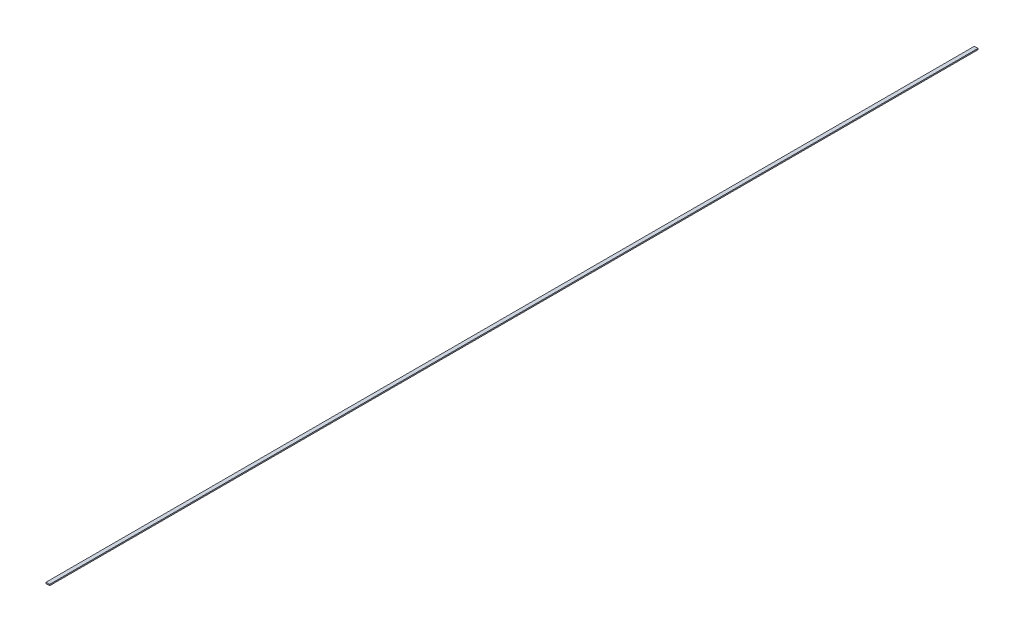
ISO-10303-21;
HEADER;
FILE_DESCRIPTION(('STEP AP214'),'2;1');
FILE_NAME('part.step','',(''),(''),'','','');
FILE_SCHEMA(('AUTOMOTIVE_DESIGN { 1 0 10303 214 1 1 1 1 }'));
ENDSEC;
DATA;
#1=APPLICATION_CONTEXT('core data for automotive mechanical design processes');
#2=APPLICATION_PROTOCOL_DEFINITION('international standard','automotive_design',2000,#1);
#3=PRODUCT_CONTEXT('',#1,'mechanical');
#4=PRODUCT('Part','Part','',(#3));
#5=PRODUCT_RELATED_PRODUCT_CATEGORY('part','',(#4));
#6=PRODUCT_DEFINITION_FORMATION('','',#4);
#7=PRODUCT_DEFINITION_CONTEXT('part definition',#1,'design');
#8=PRODUCT_DEFINITION('design','',#6,#7);
#9=PRODUCT_DEFINITION_SHAPE('','',#8);
#10=(LENGTH_UNIT() NAMED_UNIT(*) SI_UNIT(.MILLI.,.METRE.));
#11=(NAMED_UNIT(*) PLANE_ANGLE_UNIT() SI_UNIT($,.RADIAN.));
#12=(NAMED_UNIT(*) SI_UNIT($,.STERADIAN.) SOLID_ANGLE_UNIT());
#13=UNCERTAINTY_MEASURE_WITH_UNIT(LENGTH_MEASURE(1.E-05),#10,'distance_accuracy_value','');
#14=(GEOMETRIC_REPRESENTATION_CONTEXT(3) GLOBAL_UNCERTAINTY_ASSIGNED_CONTEXT((#13)) GLOBAL_UNIT_ASSIGNED_CONTEXT((#10,
#11,#12)) REPRESENTATION_CONTEXT('',''));
#15=CARTESIAN_POINT('',(0.,0.,0.));
#16=DIRECTION('',(0.,0.,1.));
#17=DIRECTION('',(1.,0.,0.));
#18=AXIS2_PLACEMENT_3D('',#15,#16,#17);
#19=CARTESIAN_POINT('',(151.8745431792,-5.19181803951944,759.5));
#20=DIRECTION('',(-1.,0.,0.));
#21=DIRECTION('',(0.,0.,1.));
#22=AXIS2_PLACEMENT_3D('',#19,#20,#21);
#23=PLANE('',#22);
#24=DIRECTION('',(0.,1.,0.));
#25=VECTOR('',#24,1.);
#26=CARTESIAN_POINT('',(151.8745431792,-5.19181803951944,0.));
#27=LINE('',#26,#25);
#28=CARTESIAN_POINT('',(151.8745431792,-6.19181803951944,0.));
#29=VERTEX_POINT('',#28);
#30=CARTESIAN_POINT('',(151.8745431792,-5.19181803951944,0.));
#31=VERTEX_POINT('',#30);
#32=EDGE_CURVE('E104',#29,#31,#27,.T.);
#33=ORIENTED_EDGE('',*,*,#32,.T.);
#34=DIRECTION('',(0.,0.,-1.));
#35=VECTOR('',#34,1.);
#36=CARTESIAN_POINT('',(151.8745431792,-5.19181803951944,759.5));
#37=LINE('',#36,#35);
#38=CARTESIAN_POINT('',(151.8745431792,-5.19181803951944,759.5));
#39=VERTEX_POINT('',#38);
#40=EDGE_CURVE('E11',#39,#31,#37,.T.);
#41=ORIENTED_EDGE('',*,*,#40,.F.);
#42=DIRECTION('',(0.,1.,0.));
#43=VECTOR('',#42,1.);
#44=CARTESIAN_POINT('',(151.8745431792,-5.19181803951944,759.5));
#45=LINE('',#44,#43);
#46=CARTESIAN_POINT('',(151.8745431792,-6.19181803951944,759.5));
#47=VERTEX_POINT('',#46);
#48=EDGE_CURVE('E92',#47,#39,#45,.T.);
#49=ORIENTED_EDGE('',*,*,#48,.F.);
#50=DIRECTION('',(0.,0.,-1.));
#51=VECTOR('',#50,1.);
#52=CARTESIAN_POINT('',(151.8745431792,-6.19181803951944,759.5));
#53=LINE('',#52,#51);
#54=EDGE_CURVE('E100',#47,#29,#53,.T.);
#55=ORIENTED_EDGE('',*,*,#54,.T.);
#56=EDGE_LOOP('',(#33,#41,#49,#55));
#57=FACE_BOUND('',#56,.T.);
#58=ADVANCED_FACE('F41',(#57),#23,.F.);
#59=CARTESIAN_POINT('',(151.8745431792,-5.19181803951944,759.5));
#60=DIRECTION('',(0.,-1.,0.));
#61=DIRECTION('',(0.,0.,-1.));
#62=AXIS2_PLACEMENT_3D('',#59,#60,#61);
#63=PLANE('',#62);
#64=DIRECTION('',(-1.,0.,0.));
#65=VECTOR('',#64,1.);
#66=CARTESIAN_POINT('',(151.8745431792,-5.19181803951944,0.));
#67=LINE('',#66,#65);
#68=CARTESIAN_POINT('',(148.8745431792,-5.19181803951944,0.));
#69=VERTEX_POINT('',#68);
#70=EDGE_CURVE('E96',#31,#69,#67,.T.);
#71=ORIENTED_EDGE('',*,*,#70,.T.);
#72=DIRECTION('',(0.,0.,-1.));
#73=VECTOR('',#72,1.);
#74=CARTESIAN_POINT('',(148.8745431792,-5.19181803951944,759.5));
#75=LINE('',#74,#73);
#76=CARTESIAN_POINT('',(148.8745431792,-5.19181803951944,759.5));
#77=VERTEX_POINT('',#76);
#78=EDGE_CURVE('E49',#77,#69,#75,.T.);
#79=ORIENTED_EDGE('',*,*,#78,.F.);
#80=DIRECTION('',(-1.,0.,0.));
#81=VECTOR('',#80,1.);
#82=CARTESIAN_POINT('',(151.8745431792,-5.19181803951944,759.5));
#83=LINE('',#82,#81);
#84=EDGE_CURVE('E87',#39,#77,#83,.T.);
#85=ORIENTED_EDGE('',*,*,#84,.F.);
#86=ORIENTED_EDGE('',*,*,#40,.T.);
#87=EDGE_LOOP('',(#71,#79,#85,#86));
#88=FACE_BOUND('',#87,.T.);
#89=ADVANCED_FACE('F95',(#88),#63,.F.);
#90=CARTESIAN_POINT('',(148.8745431792,-5.19181803951944,759.5));
#91=DIRECTION('',(1.,0.,0.));
#92=DIRECTION('',(0.,0.,-1.));
#93=AXIS2_PLACEMENT_3D('',#90,#91,#92);
#94=PLANE('',#93);
#95=DIRECTION('',(0.,-1.,0.));
#96=VECTOR('',#95,1.);
#97=CARTESIAN_POINT('',(148.8745431792,-5.19181803951944,0.));
#98=LINE('',#97,#96);
#99=CARTESIAN_POINT('',(148.8745431792,-6.19181803951944,0.));
#100=VERTEX_POINT('',#99);
#101=EDGE_CURVE('E74',#69,#100,#98,.T.);
#102=ORIENTED_EDGE('',*,*,#101,.T.);
#103=DIRECTION('',(0.,0.,-1.));
#104=VECTOR('',#103,1.);
#105=CARTESIAN_POINT('',(148.8745431792,-6.19181803951944,759.5));
#106=LINE('',#105,#104);
#107=CARTESIAN_POINT('',(148.8745431792,-6.19181803951944,759.5));
#108=VERTEX_POINT('',#107);
#109=EDGE_CURVE('E97',#108,#100,#106,.T.);
#110=ORIENTED_EDGE('',*,*,#109,.F.);
#111=DIRECTION('',(0.,-1.,0.));
#112=VECTOR('',#111,1.);
#113=CARTESIAN_POINT('',(148.8745431792,-5.19181803951944,759.5));
#114=LINE('',#113,#112);
#115=EDGE_CURVE('E90',#77,#108,#114,.T.);
#116=ORIENTED_EDGE('',*,*,#115,.F.);
#117=ORIENTED_EDGE('',*,*,#78,.T.);
#118=EDGE_LOOP('',(#102,#110,#116,#117));
#119=FACE_BOUND('',#118,.T.);
#120=ADVANCED_FACE('F98',(#119),#94,.F.);
#121=CARTESIAN_POINT('',(151.8745431792,-6.19181803951944,759.5));
#122=DIRECTION('',(0.,1.,0.));
#123=DIRECTION('',(0.,0.,1.));
#124=AXIS2_PLACEMENT_3D('',#121,#122,#123);
#125=PLANE('',#124);
#126=DIRECTION('',(1.,0.,0.));
#127=VECTOR('',#126,1.);
#128=CARTESIAN_POINT('',(151.8745431792,-6.19181803951944,0.));
#129=LINE('',#128,#127);
#130=EDGE_CURVE('E80',#100,#29,#129,.T.);
#131=ORIENTED_EDGE('',*,*,#130,.T.);
#132=ORIENTED_EDGE('',*,*,#54,.F.);
#133=DIRECTION('',(1.,0.,0.));
#134=VECTOR('',#133,1.);
#135=CARTESIAN_POINT('',(151.8745431792,-6.19181803951944,759.5));
#136=LINE('',#135,#134);
#137=EDGE_CURVE('E57',#108,#47,#136,.T.);
#138=ORIENTED_EDGE('',*,*,#137,.F.);
#139=ORIENTED_EDGE('',*,*,#109,.T.);
#140=EDGE_LOOP('',(#131,#132,#138,#139));
#141=FACE_BOUND('',#140,.T.);
#142=ADVANCED_FACE('F111',(#141),#125,.F.);
#143=CARTESIAN_POINT('',(0.,0.,759.5));
#144=DIRECTION('',(0.,0.,-1.));
#145=DIRECTION('',(-1.,0.,0.));
#146=AXIS2_PLACEMENT_3D('',#143,#144,#145);
#147=PLANE('',#146);
#148=ORIENTED_EDGE('',*,*,#48,.T.);
#149=ORIENTED_EDGE('',*,*,#84,.T.);
#150=ORIENTED_EDGE('',*,*,#115,.T.);
#151=ORIENTED_EDGE('',*,*,#137,.T.);
#152=EDGE_LOOP('',(#148,#149,#150,#151));
#153=FACE_BOUND('',#152,.T.);
#154=ADVANCED_FACE('F88',(#153),#147,.F.);
#155=CARTESIAN_POINT('',(0.,0.,0.));
#156=DIRECTION('',(0.,0.,-1.));
#157=DIRECTION('',(-1.,0.,0.));
#158=AXIS2_PLACEMENT_3D('',#155,#156,#157);
#159=PLANE('',#158);
#160=ORIENTED_EDGE('',*,*,#32,.F.);
#161=ORIENTED_EDGE('',*,*,#130,.F.);
#162=ORIENTED_EDGE('',*,*,#101,.F.);
#163=ORIENTED_EDGE('',*,*,#70,.F.);
#164=EDGE_LOOP('',(#160,#161,#162,#163));
#165=FACE_BOUND('',#164,.T.);
#166=ADVANCED_FACE('F114',(#165),#159,.T.);
#167=CLOSED_SHELL('',(#58,#89,#120,#142,#154,#166));
#168=MANIFOLD_SOLID_BREP('B2',#167);
#169=ADVANCED_BREP_SHAPE_REPRESENTATION('',(#18,#168),#14);
#170=SHAPE_DEFINITION_REPRESENTATION(#9,#169);
ENDSEC;
END-ISO-10303-21;
